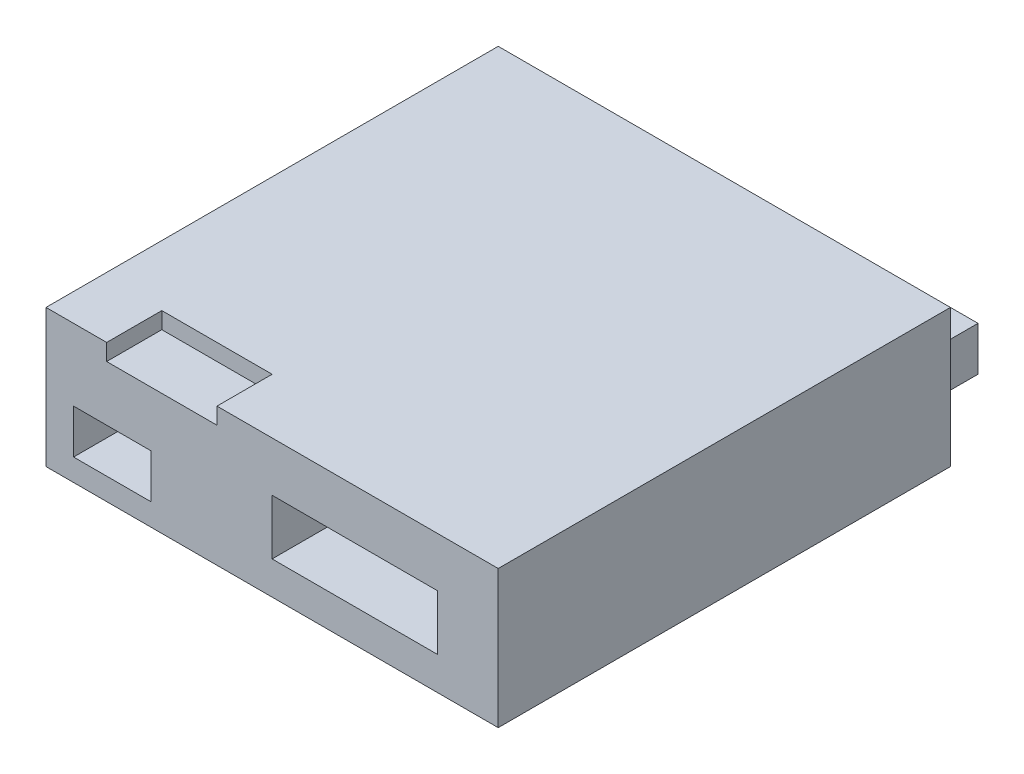
ISO-10303-21;
HEADER;
FILE_DESCRIPTION(('STEP AP214'),'2;1');
FILE_NAME('part.step','',(''),(''),'','','');
FILE_SCHEMA(('AUTOMOTIVE_DESIGN { 1 0 10303 214 1 1 1 1 }'));
ENDSEC;
DATA;
#1=APPLICATION_CONTEXT('core data for automotive mechanical design processes');
#2=APPLICATION_PROTOCOL_DEFINITION('international standard','automotive_design',2000,#1);
#3=PRODUCT_CONTEXT('',#1,'mechanical');
#4=PRODUCT('Part','Part','',(#3));
#5=PRODUCT_RELATED_PRODUCT_CATEGORY('part','',(#4));
#6=PRODUCT_DEFINITION_FORMATION('','',#4);
#7=PRODUCT_DEFINITION_CONTEXT('part definition',#1,'design');
#8=PRODUCT_DEFINITION('design','',#6,#7);
#9=PRODUCT_DEFINITION_SHAPE('','',#8);
#10=(LENGTH_UNIT() NAMED_UNIT(*) SI_UNIT(.MILLI.,.METRE.));
#11=(NAMED_UNIT(*) PLANE_ANGLE_UNIT() SI_UNIT($,.RADIAN.));
#12=(NAMED_UNIT(*) SI_UNIT($,.STERADIAN.) SOLID_ANGLE_UNIT());
#13=UNCERTAINTY_MEASURE_WITH_UNIT(LENGTH_MEASURE(1.E-05),#10,'distance_accuracy_value','');
#14=(GEOMETRIC_REPRESENTATION_CONTEXT(3) GLOBAL_UNCERTAINTY_ASSIGNED_CONTEXT((#13)) GLOBAL_UNIT_ASSIGNED_CONTEXT((#10,
#11,#12)) REPRESENTATION_CONTEXT('',''));
#15=CARTESIAN_POINT('',(0.,0.,0.));
#16=DIRECTION('',(0.,0.,1.));
#17=DIRECTION('',(1.,0.,0.));
#18=AXIS2_PLACEMENT_3D('',#15,#16,#17);
#19=CARTESIAN_POINT('',(0.,12.5,-41.));
#20=DIRECTION('',(0.,0.,1.));
#21=DIRECTION('',(1.,0.,0.));
#22=AXIS2_PLACEMENT_3D('',#19,#20,#21);
#23=PLANE('',#22);
#24=DIRECTION('',(-1.,0.,0.));
#25=VECTOR('',#24,1.);
#26=CARTESIAN_POINT('',(0.,0.,-41.));
#27=LINE('',#26,#25);
#28=CARTESIAN_POINT('',(41.,0.,-41.));
#29=VERTEX_POINT('',#28);
#30=CARTESIAN_POINT('',(0.,0.,-41.));
#31=VERTEX_POINT('',#30);
#32=EDGE_CURVE('E293',#29,#31,#27,.T.);
#33=ORIENTED_EDGE('',*,*,#32,.T.);
#34=DIRECTION('',(0.,-1.,0.));
#35=VECTOR('',#34,1.);
#36=CARTESIAN_POINT('',(0.,12.5,-41.));
#37=LINE('',#36,#35);
#38=CARTESIAN_POINT('',(0.,12.5,-41.));
#39=VERTEX_POINT('',#38);
#40=EDGE_CURVE('E301',#39,#31,#37,.T.);
#41=ORIENTED_EDGE('',*,*,#40,.F.);
#42=DIRECTION('',(-1.,0.,0.));
#43=VECTOR('',#42,1.);
#44=CARTESIAN_POINT('',(0.,12.5,-41.));
#45=LINE('',#44,#43);
#46=CARTESIAN_POINT('',(41.,12.5,-41.));
#47=VERTEX_POINT('',#46);
#48=EDGE_CURVE('E299',#47,#39,#45,.T.);
#49=ORIENTED_EDGE('',*,*,#48,.F.);
#50=DIRECTION('',(0.,-1.,0.));
#51=VECTOR('',#50,1.);
#52=CARTESIAN_POINT('',(41.,12.5,-41.));
#53=LINE('',#52,#51);
#54=EDGE_CURVE('E311',#47,#29,#53,.T.);
#55=ORIENTED_EDGE('',*,*,#54,.T.);
#56=EDGE_LOOP('',(#33,#41,#49,#55));
#57=FACE_BOUND('',#56,.T.);
#58=DIRECTION('',(0.,1.,0.));
#59=VECTOR('',#58,1.);
#60=CARTESIAN_POINT('',(27.5,7.5,-41.));
#61=LINE('',#60,#59);
#62=CARTESIAN_POINT('',(27.5,3.5,-41.));
#63=VERTEX_POINT('',#62);
#64=CARTESIAN_POINT('',(27.5,7.5,-41.));
#65=VERTEX_POINT('',#64);
#66=EDGE_CURVE('E190',#63,#65,#61,.T.);
#67=ORIENTED_EDGE('',*,*,#66,.F.);
#68=DIRECTION('',(-1.,0.,0.));
#69=VECTOR('',#68,1.);
#70=CARTESIAN_POINT('',(27.5,3.5,-41.));
#71=LINE('',#70,#69);
#72=CARTESIAN_POINT('',(38.5,3.5,-41.));
#73=VERTEX_POINT('',#72);
#74=EDGE_CURVE('E187',#73,#63,#71,.T.);
#75=ORIENTED_EDGE('',*,*,#74,.F.);
#76=DIRECTION('',(0.,-1.,0.));
#77=VECTOR('',#76,1.);
#78=CARTESIAN_POINT('',(38.5,7.5,-41.));
#79=LINE('',#78,#77);
#80=CARTESIAN_POINT('',(38.5,7.5,-41.));
#81=VERTEX_POINT('',#80);
#82=EDGE_CURVE('E53',#81,#73,#79,.T.);
#83=ORIENTED_EDGE('',*,*,#82,.F.);
#84=DIRECTION('',(1.,0.,0.));
#85=VECTOR('',#84,1.);
#86=CARTESIAN_POINT('',(27.5,7.5,-41.));
#87=LINE('',#86,#85);
#88=EDGE_CURVE('E48',#65,#81,#87,.T.);
#89=ORIENTED_EDGE('',*,*,#88,.F.);
#90=EDGE_LOOP('',(#67,#75,#83,#89));
#91=FACE_BOUND('',#90,.T.);
#92=ADVANCED_FACE('F33',(#57,#91),#23,.F.);
#93=CARTESIAN_POINT('',(0.,12.5,0.));
#94=DIRECTION('',(1.,0.,0.));
#95=DIRECTION('',(0.,0.,-1.));
#96=AXIS2_PLACEMENT_3D('',#93,#94,#95);
#97=PLANE('',#96);
#98=DIRECTION('',(0.,0.,1.));
#99=VECTOR('',#98,1.);
#100=CARTESIAN_POINT('',(0.,0.,0.));
#101=LINE('',#100,#99);
#102=CARTESIAN_POINT('',(0.,0.,0.));
#103=VERTEX_POINT('',#102);
#104=EDGE_CURVE('E282',#31,#103,#101,.T.);
#105=ORIENTED_EDGE('',*,*,#104,.T.);
#106=DIRECTION('',(0.,-1.,0.));
#107=VECTOR('',#106,1.);
#108=CARTESIAN_POINT('',(0.,12.5,0.));
#109=LINE('',#108,#107);
#110=CARTESIAN_POINT('',(0.,12.5,0.));
#111=VERTEX_POINT('',#110);
#112=EDGE_CURVE('E11',#111,#103,#109,.T.);
#113=ORIENTED_EDGE('',*,*,#112,.F.);
#114=DIRECTION('',(0.,0.,1.));
#115=VECTOR('',#114,1.);
#116=CARTESIAN_POINT('',(0.,12.5,0.));
#117=LINE('',#116,#115);
#118=EDGE_CURVE('E289',#39,#111,#117,.T.);
#119=ORIENTED_EDGE('',*,*,#118,.F.);
#120=ORIENTED_EDGE('',*,*,#40,.T.);
#121=EDGE_LOOP('',(#105,#113,#119,#120));
#122=FACE_BOUND('',#121,.T.);
#123=ADVANCED_FACE('F35',(#122),#97,.F.);
#124=CARTESIAN_POINT('',(0.,12.5,0.));
#125=DIRECTION('',(0.,0.,-1.));
#126=DIRECTION('',(-1.,0.,0.));
#127=AXIS2_PLACEMENT_3D('',#124,#125,#126);
#128=PLANE('',#127);
#129=DIRECTION('',(1.,0.,0.));
#130=VECTOR('',#129,1.);
#131=CARTESIAN_POINT('',(20.5,3.,0.));
#132=LINE('',#131,#130);
#133=CARTESIAN_POINT('',(20.5,3.,0.));
#134=VERTEX_POINT('',#133);
#135=CARTESIAN_POINT('',(35.5,3.,0.));
#136=VERTEX_POINT('',#135);
#137=EDGE_CURVE('E193',#134,#136,#132,.T.);
#138=ORIENTED_EDGE('',*,*,#137,.F.);
#139=DIRECTION('',(0.,-1.,0.));
#140=VECTOR('',#139,1.);
#141=CARTESIAN_POINT('',(20.5,8.,0.));
#142=LINE('',#141,#140);
#143=CARTESIAN_POINT('',(20.5,8.,0.));
#144=VERTEX_POINT('',#143);
#145=EDGE_CURVE('E191',#144,#134,#142,.T.);
#146=ORIENTED_EDGE('',*,*,#145,.F.);
#147=DIRECTION('',(-1.,0.,0.));
#148=VECTOR('',#147,1.);
#149=CARTESIAN_POINT('',(20.5,8.,0.));
#150=LINE('',#149,#148);
#151=CARTESIAN_POINT('',(35.5,8.,0.));
#152=VERTEX_POINT('',#151);
#153=EDGE_CURVE('E203',#152,#144,#150,.T.);
#154=ORIENTED_EDGE('',*,*,#153,.F.);
#155=DIRECTION('',(0.,1.,0.));
#156=VECTOR('',#155,1.);
#157=CARTESIAN_POINT('',(35.5,8.,0.));
#158=LINE('',#157,#156);
#159=EDGE_CURVE('E215',#136,#152,#158,.T.);
#160=ORIENTED_EDGE('',*,*,#159,.F.);
#161=EDGE_LOOP('',(#138,#146,#154,#160));
#162=FACE_BOUND('',#161,.T.);
#163=DIRECTION('',(1.,0.,0.));
#164=VECTOR('',#163,1.);
#165=CARTESIAN_POINT('',(2.5,2.,0.));
#166=LINE('',#165,#164);
#167=CARTESIAN_POINT('',(2.5,2.,0.));
#168=VERTEX_POINT('',#167);
#169=CARTESIAN_POINT('',(9.5,2.,0.));
#170=VERTEX_POINT('',#169);
#171=EDGE_CURVE('E244',#168,#170,#166,.T.);
#172=ORIENTED_EDGE('',*,*,#171,.F.);
#173=DIRECTION('',(0.,-1.,0.));
#174=VECTOR('',#173,1.);
#175=CARTESIAN_POINT('',(2.5,6.,0.));
#176=LINE('',#175,#174);
#177=CARTESIAN_POINT('',(2.5,6.,0.));
#178=VERTEX_POINT('',#177);
#179=EDGE_CURVE('E222',#178,#168,#176,.T.);
#180=ORIENTED_EDGE('',*,*,#179,.F.);
#181=DIRECTION('',(-1.,0.,0.));
#182=VECTOR('',#181,1.);
#183=CARTESIAN_POINT('',(2.5,6.,0.));
#184=LINE('',#183,#182);
#185=CARTESIAN_POINT('',(9.5,6.,0.));
#186=VERTEX_POINT('',#185);
#187=EDGE_CURVE('E233',#186,#178,#184,.T.);
#188=ORIENTED_EDGE('',*,*,#187,.F.);
#189=DIRECTION('',(0.,1.,0.));
#190=VECTOR('',#189,1.);
#191=CARTESIAN_POINT('',(9.5,6.,0.));
#192=LINE('',#191,#190);
#193=EDGE_CURVE('E247',#170,#186,#192,.T.);
#194=ORIENTED_EDGE('',*,*,#193,.F.);
#195=EDGE_LOOP('',(#172,#180,#188,#194));
#196=FACE_BOUND('',#195,.T.);
#197=DIRECTION('',(1.,0.,0.));
#198=VECTOR('',#197,1.);
#199=CARTESIAN_POINT('',(5.5,11.,0.));
#200=LINE('',#199,#198);
#201=CARTESIAN_POINT('',(5.5,11.,0.));
#202=VERTEX_POINT('',#201);
#203=CARTESIAN_POINT('',(15.5,11.,0.));
#204=VERTEX_POINT('',#203);
#205=EDGE_CURVE('E276',#202,#204,#200,.T.);
#206=ORIENTED_EDGE('',*,*,#205,.F.);
#207=DIRECTION('',(0.,-1.,0.));
#208=VECTOR('',#207,1.);
#209=CARTESIAN_POINT('',(5.5,12.5,0.));
#210=LINE('',#209,#208);
#211=CARTESIAN_POINT('',(5.5,12.5,0.));
#212=VERTEX_POINT('',#211);
#213=EDGE_CURVE('E254',#212,#202,#210,.T.);
#214=ORIENTED_EDGE('',*,*,#213,.F.);
#215=DIRECTION('',(1.,0.,0.));
#216=VECTOR('',#215,1.);
#217=CARTESIAN_POINT('',(0.,12.5,0.));
#218=LINE('',#217,#216);
#219=EDGE_CURVE('E294',#111,#212,#218,.T.);
#220=ORIENTED_EDGE('',*,*,#219,.F.);
#221=ORIENTED_EDGE('',*,*,#112,.T.);
#222=DIRECTION('',(1.,0.,0.));
#223=VECTOR('',#222,1.);
#224=CARTESIAN_POINT('',(0.,0.,0.));
#225=LINE('',#224,#223);
#226=CARTESIAN_POINT('',(41.,0.,0.));
#227=VERTEX_POINT('',#226);
#228=EDGE_CURVE('E304',#103,#227,#225,.T.);
#229=ORIENTED_EDGE('',*,*,#228,.T.);
#230=DIRECTION('',(0.,-1.,0.));
#231=VECTOR('',#230,1.);
#232=CARTESIAN_POINT('',(41.,12.5,0.));
#233=LINE('',#232,#231);
#234=CARTESIAN_POINT('',(41.,12.5,0.));
#235=VERTEX_POINT('',#234);
#236=EDGE_CURVE('E41',#235,#227,#233,.T.);
#237=ORIENTED_EDGE('',*,*,#236,.F.);
#238=CARTESIAN_POINT('',(15.5,12.5,0.));
#239=VERTEX_POINT('',#238);
#240=EDGE_CURVE('E292',#239,#235,#218,.T.);
#241=ORIENTED_EDGE('',*,*,#240,.F.);
#242=DIRECTION('',(0.,1.,0.));
#243=VECTOR('',#242,1.);
#244=CARTESIAN_POINT('',(15.5,12.5,0.));
#245=LINE('',#244,#243);
#246=EDGE_CURVE('E265',#204,#239,#245,.T.);
#247=ORIENTED_EDGE('',*,*,#246,.F.);
#248=EDGE_LOOP('',(#206,#214,#220,#221,#229,#237,#241,#247));
#249=FACE_BOUND('',#248,.T.);
#250=ADVANCED_FACE('F339',(#162,#196,#249),#128,.F.);
#251=CARTESIAN_POINT('',(41.,12.5,0.));
#252=DIRECTION('',(-1.,0.,0.));
#253=DIRECTION('',(0.,0.,1.));
#254=AXIS2_PLACEMENT_3D('',#251,#252,#253);
#255=PLANE('',#254);
#256=DIRECTION('',(0.,0.,-1.));
#257=VECTOR('',#256,1.);
#258=CARTESIAN_POINT('',(41.,0.,0.));
#259=LINE('',#258,#257);
#260=EDGE_CURVE('E306',#227,#29,#259,.T.);
#261=ORIENTED_EDGE('',*,*,#260,.T.);
#262=ORIENTED_EDGE('',*,*,#54,.F.);
#263=DIRECTION('',(0.,0.,-1.));
#264=VECTOR('',#263,1.);
#265=CARTESIAN_POINT('',(41.,12.5,0.));
#266=LINE('',#265,#264);
#267=EDGE_CURVE('E297',#235,#47,#266,.T.);
#268=ORIENTED_EDGE('',*,*,#267,.F.);
#269=ORIENTED_EDGE('',*,*,#236,.T.);
#270=EDGE_LOOP('',(#261,#262,#268,#269));
#271=FACE_BOUND('',#270,.T.);
#272=ADVANCED_FACE('F318',(#271),#255,.F.);
#273=CARTESIAN_POINT('',(0.,12.5,0.));
#274=DIRECTION('',(0.,-1.,0.));
#275=DIRECTION('',(0.,0.,-1.));
#276=AXIS2_PLACEMENT_3D('',#273,#274,#275);
#277=PLANE('',#276);
#278=ORIENTED_EDGE('',*,*,#219,.T.);
#279=DIRECTION('',(0.,0.,1.));
#280=VECTOR('',#279,1.);
#281=CARTESIAN_POINT('',(5.5,12.5,-5.));
#282=LINE('',#281,#280);
#283=CARTESIAN_POINT('',(5.5,12.5,-5.));
#284=VERTEX_POINT('',#283);
#285=EDGE_CURVE('E280',#284,#212,#282,.T.);
#286=ORIENTED_EDGE('',*,*,#285,.F.);
#287=DIRECTION('',(-1.,0.,0.));
#288=VECTOR('',#287,1.);
#289=CARTESIAN_POINT('',(5.5,12.5,-5.));
#290=LINE('',#289,#288);
#291=CARTESIAN_POINT('',(15.5,12.5,-5.));
#292=VERTEX_POINT('',#291);
#293=EDGE_CURVE('E270',#292,#284,#290,.T.);
#294=ORIENTED_EDGE('',*,*,#293,.F.);
#295=DIRECTION('',(0.,0.,1.));
#296=VECTOR('',#295,1.);
#297=CARTESIAN_POINT('',(15.5,12.5,-5.));
#298=LINE('',#297,#296);
#299=EDGE_CURVE('E283',#292,#239,#298,.T.);
#300=ORIENTED_EDGE('',*,*,#299,.T.);
#301=ORIENTED_EDGE('',*,*,#240,.T.);
#302=ORIENTED_EDGE('',*,*,#267,.T.);
#303=ORIENTED_EDGE('',*,*,#48,.T.);
#304=ORIENTED_EDGE('',*,*,#118,.T.);
#305=EDGE_LOOP('',(#278,#286,#294,#300,#301,#302,#303,#304));
#306=FACE_BOUND('',#305,.T.);
#307=ADVANCED_FACE('F333',(#306),#277,.F.);
#308=CARTESIAN_POINT('',(0.,0.,0.));
#309=DIRECTION('',(0.,-1.,0.));
#310=DIRECTION('',(0.,0.,-1.));
#311=AXIS2_PLACEMENT_3D('',#308,#309,#310);
#312=PLANE('',#311);
#313=ORIENTED_EDGE('',*,*,#104,.F.);
#314=ORIENTED_EDGE('',*,*,#32,.F.);
#315=ORIENTED_EDGE('',*,*,#260,.F.);
#316=ORIENTED_EDGE('',*,*,#228,.F.);
#317=EDGE_LOOP('',(#313,#314,#315,#316));
#318=FACE_BOUND('',#317,.T.);
#319=ADVANCED_FACE('F325',(#318),#312,.T.);
#320=CARTESIAN_POINT('',(5.5,12.5,-5.));
#321=DIRECTION('',(-1.,0.,0.));
#322=DIRECTION('',(0.,-1.,0.));
#323=AXIS2_PLACEMENT_3D('',#320,#321,#322);
#324=PLANE('',#323);
#325=ORIENTED_EDGE('',*,*,#213,.T.);
#326=DIRECTION('',(0.,0.,1.));
#327=VECTOR('',#326,1.);
#328=CARTESIAN_POINT('',(5.5,11.,-5.));
#329=LINE('',#328,#327);
#330=CARTESIAN_POINT('',(5.5,11.,-5.));
#331=VERTEX_POINT('',#330);
#332=EDGE_CURVE('E273',#331,#202,#329,.T.);
#333=ORIENTED_EDGE('',*,*,#332,.F.);
#334=DIRECTION('',(0.,-1.,0.));
#335=VECTOR('',#334,1.);
#336=CARTESIAN_POINT('',(5.5,12.5,-5.));
#337=LINE('',#336,#335);
#338=EDGE_CURVE('E261',#284,#331,#337,.T.);
#339=ORIENTED_EDGE('',*,*,#338,.F.);
#340=ORIENTED_EDGE('',*,*,#285,.T.);
#341=EDGE_LOOP('',(#325,#333,#339,#340));
#342=FACE_BOUND('',#341,.T.);
#343=ADVANCED_FACE('F348',(#342),#324,.F.);
#344=CARTESIAN_POINT('',(15.5,12.5,-5.));
#345=DIRECTION('',(1.,0.,0.));
#346=DIRECTION('',(0.,0.,-1.));
#347=AXIS2_PLACEMENT_3D('',#344,#345,#346);
#348=PLANE('',#347);
#349=ORIENTED_EDGE('',*,*,#246,.T.);
#350=ORIENTED_EDGE('',*,*,#299,.F.);
#351=DIRECTION('',(0.,1.,0.));
#352=VECTOR('',#351,1.);
#353=CARTESIAN_POINT('',(15.5,12.5,-5.));
#354=LINE('',#353,#352);
#355=CARTESIAN_POINT('',(15.5,11.,-5.));
#356=VERTEX_POINT('',#355);
#357=EDGE_CURVE('E268',#356,#292,#354,.T.);
#358=ORIENTED_EDGE('',*,*,#357,.F.);
#359=DIRECTION('',(0.,0.,1.));
#360=VECTOR('',#359,1.);
#361=CARTESIAN_POINT('',(15.5,11.,-5.));
#362=LINE('',#361,#360);
#363=EDGE_CURVE('E286',#356,#204,#362,.T.);
#364=ORIENTED_EDGE('',*,*,#363,.T.);
#365=EDGE_LOOP('',(#349,#350,#358,#364));
#366=FACE_BOUND('',#365,.T.);
#367=ADVANCED_FACE('F342',(#366),#348,.F.);
#368=CARTESIAN_POINT('',(5.5,11.,-5.));
#369=DIRECTION('',(0.,-1.,0.));
#370=DIRECTION('',(0.,0.,-1.));
#371=AXIS2_PLACEMENT_3D('',#368,#369,#370);
#372=PLANE('',#371);
#373=ORIENTED_EDGE('',*,*,#205,.T.);
#374=ORIENTED_EDGE('',*,*,#363,.F.);
#375=DIRECTION('',(1.,0.,0.));
#376=VECTOR('',#375,1.);
#377=CARTESIAN_POINT('',(5.5,11.,-5.));
#378=LINE('',#377,#376);
#379=EDGE_CURVE('E264',#331,#356,#378,.T.);
#380=ORIENTED_EDGE('',*,*,#379,.F.);
#381=ORIENTED_EDGE('',*,*,#332,.T.);
#382=EDGE_LOOP('',(#373,#374,#380,#381));
#383=FACE_BOUND('',#382,.T.);
#384=ADVANCED_FACE('F346',(#383),#372,.F.);
#385=CARTESIAN_POINT('',(0.,0.,-5.));
#386=DIRECTION('',(0.,0.,1.));
#387=DIRECTION('',(1.,0.,0.));
#388=AXIS2_PLACEMENT_3D('',#385,#386,#387);
#389=PLANE('',#388);
#390=ORIENTED_EDGE('',*,*,#338,.T.);
#391=ORIENTED_EDGE('',*,*,#379,.T.);
#392=ORIENTED_EDGE('',*,*,#357,.T.);
#393=ORIENTED_EDGE('',*,*,#293,.T.);
#394=EDGE_LOOP('',(#390,#391,#392,#393));
#395=FACE_BOUND('',#394,.T.);
#396=ADVANCED_FACE('F350',(#395),#389,.T.);
#397=CARTESIAN_POINT('',(2.5,6.,-5.));
#398=DIRECTION('',(-1.,0.,0.));
#399=DIRECTION('',(0.,-1.,0.));
#400=AXIS2_PLACEMENT_3D('',#397,#398,#399);
#401=PLANE('',#400);
#402=ORIENTED_EDGE('',*,*,#179,.T.);
#403=DIRECTION('',(0.,0.,1.));
#404=VECTOR('',#403,1.);
#405=CARTESIAN_POINT('',(2.5,2.,-5.));
#406=LINE('',#405,#404);
#407=CARTESIAN_POINT('',(2.5,2.,-5.));
#408=VERTEX_POINT('',#407);
#409=EDGE_CURVE('E242',#408,#168,#406,.T.);
#410=ORIENTED_EDGE('',*,*,#409,.F.);
#411=DIRECTION('',(0.,-1.,0.));
#412=VECTOR('',#411,1.);
#413=CARTESIAN_POINT('',(2.5,6.,-5.));
#414=LINE('',#413,#412);
#415=CARTESIAN_POINT('',(2.5,6.,-5.));
#416=VERTEX_POINT('',#415);
#417=EDGE_CURVE('E229',#416,#408,#414,.T.);
#418=ORIENTED_EDGE('',*,*,#417,.F.);
#419=DIRECTION('',(0.,0.,1.));
#420=VECTOR('',#419,1.);
#421=CARTESIAN_POINT('',(2.5,6.,-5.));
#422=LINE('',#421,#420);
#423=EDGE_CURVE('E252',#416,#178,#422,.T.);
#424=ORIENTED_EDGE('',*,*,#423,.T.);
#425=EDGE_LOOP('',(#402,#410,#418,#424));
#426=FACE_BOUND('',#425,.T.);
#427=ADVANCED_FACE('F352',(#426),#401,.F.);
#428=CARTESIAN_POINT('',(2.5,6.,-5.));
#429=DIRECTION('',(0.,1.,0.));
#430=DIRECTION('',(0.,0.,1.));
#431=AXIS2_PLACEMENT_3D('',#428,#429,#430);
#432=PLANE('',#431);
#433=ORIENTED_EDGE('',*,*,#187,.T.);
#434=ORIENTED_EDGE('',*,*,#423,.F.);
#435=DIRECTION('',(-1.,0.,0.));
#436=VECTOR('',#435,1.);
#437=CARTESIAN_POINT('',(2.5,6.,-5.));
#438=LINE('',#437,#436);
#439=CARTESIAN_POINT('',(9.5,6.,-5.));
#440=VERTEX_POINT('',#439);
#441=EDGE_CURVE('E239',#440,#416,#438,.T.);
#442=ORIENTED_EDGE('',*,*,#441,.F.);
#443=DIRECTION('',(0.,0.,1.));
#444=VECTOR('',#443,1.);
#445=CARTESIAN_POINT('',(9.5,6.,-5.));
#446=LINE('',#445,#444);
#447=EDGE_CURVE('E255',#440,#186,#446,.T.);
#448=ORIENTED_EDGE('',*,*,#447,.T.);
#449=EDGE_LOOP('',(#433,#434,#442,#448));
#450=FACE_BOUND('',#449,.T.);
#451=ADVANCED_FACE('F358',(#450),#432,.F.);
#452=CARTESIAN_POINT('',(9.5,6.,-5.));
#453=DIRECTION('',(1.,0.,0.));
#454=DIRECTION('',(0.,0.,-1.));
#455=AXIS2_PLACEMENT_3D('',#452,#453,#454);
#456=PLANE('',#455);
#457=ORIENTED_EDGE('',*,*,#193,.T.);
#458=ORIENTED_EDGE('',*,*,#447,.F.);
#459=DIRECTION('',(0.,1.,0.));
#460=VECTOR('',#459,1.);
#461=CARTESIAN_POINT('',(9.5,6.,-5.));
#462=LINE('',#461,#460);
#463=CARTESIAN_POINT('',(9.5,2.,-5.));
#464=VERTEX_POINT('',#463);
#465=EDGE_CURVE('E236',#464,#440,#462,.T.);
#466=ORIENTED_EDGE('',*,*,#465,.F.);
#467=DIRECTION('',(0.,0.,1.));
#468=VECTOR('',#467,1.);
#469=CARTESIAN_POINT('',(9.5,2.,-5.));
#470=LINE('',#469,#468);
#471=EDGE_CURVE('E257',#464,#170,#470,.T.);
#472=ORIENTED_EDGE('',*,*,#471,.T.);
#473=EDGE_LOOP('',(#457,#458,#466,#472));
#474=FACE_BOUND('',#473,.T.);
#475=ADVANCED_FACE('F392',(#474),#456,.F.);
#476=CARTESIAN_POINT('',(2.5,2.,-5.));
#477=DIRECTION('',(0.,-1.,0.));
#478=DIRECTION('',(0.,0.,-1.));
#479=AXIS2_PLACEMENT_3D('',#476,#477,#478);
#480=PLANE('',#479);
#481=ORIENTED_EDGE('',*,*,#171,.T.);
#482=ORIENTED_EDGE('',*,*,#471,.F.);
#483=DIRECTION('',(1.,0.,0.));
#484=VECTOR('',#483,1.);
#485=CARTESIAN_POINT('',(2.5,2.,-5.));
#486=LINE('',#485,#484);
#487=EDGE_CURVE('E232',#408,#464,#486,.T.);
#488=ORIENTED_EDGE('',*,*,#487,.F.);
#489=ORIENTED_EDGE('',*,*,#409,.T.);
#490=EDGE_LOOP('',(#481,#482,#488,#489));
#491=FACE_BOUND('',#490,.T.);
#492=ADVANCED_FACE('F385',(#491),#480,.F.);
#493=CARTESIAN_POINT('',(0.,0.,-5.));
#494=DIRECTION('',(0.,0.,1.));
#495=DIRECTION('',(1.,0.,0.));
#496=AXIS2_PLACEMENT_3D('',#493,#494,#495);
#497=PLANE('',#496);
#498=ORIENTED_EDGE('',*,*,#417,.T.);
#499=ORIENTED_EDGE('',*,*,#487,.T.);
#500=ORIENTED_EDGE('',*,*,#465,.T.);
#501=ORIENTED_EDGE('',*,*,#441,.T.);
#502=EDGE_LOOP('',(#498,#499,#500,#501));
#503=FACE_BOUND('',#502,.T.);
#504=ADVANCED_FACE('F394',(#503),#497,.T.);
#505=CARTESIAN_POINT('',(20.5,8.,-5.));
#506=DIRECTION('',(-1.,0.,0.));
#507=DIRECTION('',(0.,0.,1.));
#508=AXIS2_PLACEMENT_3D('',#505,#506,#507);
#509=PLANE('',#508);
#510=ORIENTED_EDGE('',*,*,#145,.T.);
#511=DIRECTION('',(0.,0.,1.));
#512=VECTOR('',#511,1.);
#513=CARTESIAN_POINT('',(20.5,3.,-5.));
#514=LINE('',#513,#512);
#515=CARTESIAN_POINT('',(20.5,3.,-5.));
#516=VERTEX_POINT('',#515);
#517=EDGE_CURVE('E211',#516,#134,#514,.T.);
#518=ORIENTED_EDGE('',*,*,#517,.F.);
#519=DIRECTION('',(0.,-1.,0.));
#520=VECTOR('',#519,1.);
#521=CARTESIAN_POINT('',(20.5,8.,-5.));
#522=LINE('',#521,#520);
#523=CARTESIAN_POINT('',(20.5,8.,-5.));
#524=VERTEX_POINT('',#523);
#525=EDGE_CURVE('E199',#524,#516,#522,.T.);
#526=ORIENTED_EDGE('',*,*,#525,.F.);
#527=DIRECTION('',(0.,0.,1.));
#528=VECTOR('',#527,1.);
#529=CARTESIAN_POINT('',(20.5,8.,-5.));
#530=LINE('',#529,#528);
#531=EDGE_CURVE('E220',#524,#144,#530,.T.);
#532=ORIENTED_EDGE('',*,*,#531,.T.);
#533=EDGE_LOOP('',(#510,#518,#526,#532));
#534=FACE_BOUND('',#533,.T.);
#535=ADVANCED_FACE('F396',(#534),#509,.F.);
#536=CARTESIAN_POINT('',(20.5,8.,-5.));
#537=DIRECTION('',(0.,1.,0.));
#538=DIRECTION('',(0.,0.,1.));
#539=AXIS2_PLACEMENT_3D('',#536,#537,#538);
#540=PLANE('',#539);
#541=ORIENTED_EDGE('',*,*,#153,.T.);
#542=ORIENTED_EDGE('',*,*,#531,.F.);
#543=DIRECTION('',(-1.,0.,0.));
#544=VECTOR('',#543,1.);
#545=CARTESIAN_POINT('',(20.5,8.,-5.));
#546=LINE('',#545,#544);
#547=CARTESIAN_POINT('',(35.5,8.,-5.));
#548=VERTEX_POINT('',#547);
#549=EDGE_CURVE('E209',#548,#524,#546,.T.);
#550=ORIENTED_EDGE('',*,*,#549,.F.);
#551=DIRECTION('',(0.,0.,1.));
#552=VECTOR('',#551,1.);
#553=CARTESIAN_POINT('',(35.5,8.,-5.));
#554=LINE('',#553,#552);
#555=EDGE_CURVE('E223',#548,#152,#554,.T.);
#556=ORIENTED_EDGE('',*,*,#555,.T.);
#557=EDGE_LOOP('',(#541,#542,#550,#556));
#558=FACE_BOUND('',#557,.T.);
#559=ADVANCED_FACE('F402',(#558),#540,.F.);
#560=CARTESIAN_POINT('',(35.5,8.,-5.));
#561=DIRECTION('',(1.,0.,0.));
#562=DIRECTION('',(0.,0.,-1.));
#563=AXIS2_PLACEMENT_3D('',#560,#561,#562);
#564=PLANE('',#563);
#565=ORIENTED_EDGE('',*,*,#159,.T.);
#566=ORIENTED_EDGE('',*,*,#555,.F.);
#567=DIRECTION('',(0.,1.,0.));
#568=VECTOR('',#567,1.);
#569=CARTESIAN_POINT('',(35.5,8.,-5.));
#570=LINE('',#569,#568);
#571=CARTESIAN_POINT('',(35.5,3.,-5.));
#572=VERTEX_POINT('',#571);
#573=EDGE_CURVE('E206',#572,#548,#570,.T.);
#574=ORIENTED_EDGE('',*,*,#573,.F.);
#575=DIRECTION('',(0.,0.,1.));
#576=VECTOR('',#575,1.);
#577=CARTESIAN_POINT('',(35.5,3.,-5.));
#578=LINE('',#577,#576);
#579=EDGE_CURVE('E225',#572,#136,#578,.T.);
#580=ORIENTED_EDGE('',*,*,#579,.T.);
#581=EDGE_LOOP('',(#565,#566,#574,#580));
#582=FACE_BOUND('',#581,.T.);
#583=ADVANCED_FACE('F444',(#582),#564,.F.);
#584=CARTESIAN_POINT('',(20.5,3.,-5.));
#585=DIRECTION('',(0.,-1.,0.));
#586=DIRECTION('',(0.,0.,-1.));
#587=AXIS2_PLACEMENT_3D('',#584,#585,#586);
#588=PLANE('',#587);
#589=ORIENTED_EDGE('',*,*,#137,.T.);
#590=ORIENTED_EDGE('',*,*,#579,.F.);
#591=DIRECTION('',(1.,0.,0.));
#592=VECTOR('',#591,1.);
#593=CARTESIAN_POINT('',(20.5,3.,-5.));
#594=LINE('',#593,#592);
#595=EDGE_CURVE('E202',#516,#572,#594,.T.);
#596=ORIENTED_EDGE('',*,*,#595,.F.);
#597=ORIENTED_EDGE('',*,*,#517,.T.);
#598=EDGE_LOOP('',(#589,#590,#596,#597));
#599=FACE_BOUND('',#598,.T.);
#600=ADVANCED_FACE('F454',(#599),#588,.F.);
#601=CARTESIAN_POINT('',(0.,0.,-5.));
#602=DIRECTION('',(0.,0.,1.));
#603=DIRECTION('',(1.,0.,0.));
#604=AXIS2_PLACEMENT_3D('',#601,#602,#603);
#605=PLANE('',#604);
#606=ORIENTED_EDGE('',*,*,#525,.T.);
#607=ORIENTED_EDGE('',*,*,#595,.T.);
#608=ORIENTED_EDGE('',*,*,#573,.T.);
#609=ORIENTED_EDGE('',*,*,#549,.T.);
#610=EDGE_LOOP('',(#606,#607,#608,#609));
#611=FACE_BOUND('',#610,.T.);
#612=ADVANCED_FACE('F464',(#611),#605,.T.);
#613=CARTESIAN_POINT('',(27.5,7.5,-46.));
#614=DIRECTION('',(1.,0.,0.));
#615=DIRECTION('',(0.,1.,0.));
#616=AXIS2_PLACEMENT_3D('',#613,#614,#615);
#617=PLANE('',#616);
#618=ORIENTED_EDGE('',*,*,#66,.T.);
#619=DIRECTION('',(0.,0.,1.));
#620=VECTOR('',#619,1.);
#621=CARTESIAN_POINT('',(27.5,7.5,-46.));
#622=LINE('',#621,#620);
#623=CARTESIAN_POINT('',(27.5,7.5,-46.));
#624=VERTEX_POINT('',#623);
#625=EDGE_CURVE('E171',#624,#65,#622,.T.);
#626=ORIENTED_EDGE('',*,*,#625,.F.);
#627=DIRECTION('',(0.,1.,0.));
#628=VECTOR('',#627,1.);
#629=CARTESIAN_POINT('',(27.5,7.5,-46.));
#630=LINE('',#629,#628);
#631=CARTESIAN_POINT('',(27.5,3.5,-46.));
#632=VERTEX_POINT('',#631);
#633=EDGE_CURVE('E178',#632,#624,#630,.T.);
#634=ORIENTED_EDGE('',*,*,#633,.F.);
#635=DIRECTION('',(0.,0.,1.));
#636=VECTOR('',#635,1.);
#637=CARTESIAN_POINT('',(27.5,3.5,-46.));
#638=LINE('',#637,#636);
#639=EDGE_CURVE('E527',#632,#63,#638,.T.);
#640=ORIENTED_EDGE('',*,*,#639,.T.);
#641=EDGE_LOOP('',(#618,#626,#634,#640));
#642=FACE_BOUND('',#641,.T.);
#643=ADVANCED_FACE('F189',(#642),#617,.F.);
#644=CARTESIAN_POINT('',(27.5,7.5,-46.));
#645=DIRECTION('',(0.,-1.,0.));
#646=DIRECTION('',(1.,0.,0.));
#647=AXIS2_PLACEMENT_3D('',#644,#645,#646);
#648=PLANE('',#647);
#649=ORIENTED_EDGE('',*,*,#88,.T.);
#650=DIRECTION('',(0.,0.,1.));
#651=VECTOR('',#650,1.);
#652=CARTESIAN_POINT('',(38.5,7.5,-46.));
#653=LINE('',#652,#651);
#654=CARTESIAN_POINT('',(38.5,7.5,-46.));
#655=VERTEX_POINT('',#654);
#656=EDGE_CURVE('E174',#655,#81,#653,.T.);
#657=ORIENTED_EDGE('',*,*,#656,.F.);
#658=DIRECTION('',(1.,0.,0.));
#659=VECTOR('',#658,1.);
#660=CARTESIAN_POINT('',(27.5,7.5,-46.));
#661=LINE('',#660,#659);
#662=EDGE_CURVE('E167',#624,#655,#661,.T.);
#663=ORIENTED_EDGE('',*,*,#662,.F.);
#664=ORIENTED_EDGE('',*,*,#625,.T.);
#665=EDGE_LOOP('',(#649,#657,#663,#664));
#666=FACE_BOUND('',#665,.T.);
#667=ADVANCED_FACE('F169',(#666),#648,.F.);
#668=CARTESIAN_POINT('',(38.5,7.5,-46.));
#669=DIRECTION('',(-1.,0.,0.));
#670=DIRECTION('',(0.,0.,1.));
#671=AXIS2_PLACEMENT_3D('',#668,#669,#670);
#672=PLANE('',#671);
#673=ORIENTED_EDGE('',*,*,#82,.T.);
#674=DIRECTION('',(0.,0.,1.));
#675=VECTOR('',#674,1.);
#676=CARTESIAN_POINT('',(38.5,3.5,-46.));
#677=LINE('',#676,#675);
#678=CARTESIAN_POINT('',(38.5,3.5,-46.));
#679=VERTEX_POINT('',#678);
#680=EDGE_CURVE('E195',#679,#73,#677,.T.);
#681=ORIENTED_EDGE('',*,*,#680,.F.);
#682=DIRECTION('',(0.,-1.,0.));
#683=VECTOR('',#682,1.);
#684=CARTESIAN_POINT('',(38.5,7.5,-46.));
#685=LINE('',#684,#683);
#686=EDGE_CURVE('E177',#655,#679,#685,.T.);
#687=ORIENTED_EDGE('',*,*,#686,.F.);
#688=ORIENTED_EDGE('',*,*,#656,.T.);
#689=EDGE_LOOP('',(#673,#681,#687,#688));
#690=FACE_BOUND('',#689,.T.);
#691=ADVANCED_FACE('F494',(#690),#672,.F.);
#692=CARTESIAN_POINT('',(27.5,3.5,-46.));
#693=DIRECTION('',(0.,1.,0.));
#694=DIRECTION('',(-1.,0.,0.));
#695=AXIS2_PLACEMENT_3D('',#692,#693,#694);
#696=PLANE('',#695);
#697=ORIENTED_EDGE('',*,*,#74,.T.);
#698=ORIENTED_EDGE('',*,*,#639,.F.);
#699=DIRECTION('',(-1.,0.,0.));
#700=VECTOR('',#699,1.);
#701=CARTESIAN_POINT('',(27.5,3.5,-46.));
#702=LINE('',#701,#700);
#703=EDGE_CURVE('E183',#679,#632,#702,.T.);
#704=ORIENTED_EDGE('',*,*,#703,.F.);
#705=ORIENTED_EDGE('',*,*,#680,.T.);
#706=EDGE_LOOP('',(#697,#698,#704,#705));
#707=FACE_BOUND('',#706,.T.);
#708=ADVANCED_FACE('F503',(#707),#696,.F.);
#709=CARTESIAN_POINT('',(0.,0.,-46.));
#710=DIRECTION('',(0.,0.,1.));
#711=DIRECTION('',(1.,0.,0.));
#712=AXIS2_PLACEMENT_3D('',#709,#710,#711);
#713=PLANE('',#712);
#714=ORIENTED_EDGE('',*,*,#633,.T.);
#715=ORIENTED_EDGE('',*,*,#662,.T.);
#716=ORIENTED_EDGE('',*,*,#686,.T.);
#717=ORIENTED_EDGE('',*,*,#703,.T.);
#718=EDGE_LOOP('',(#714,#715,#716,#717));
#719=FACE_BOUND('',#718,.T.);
#720=ADVANCED_FACE('F181',(#719),#713,.F.);
#721=CLOSED_SHELL('',(#92,#123,#250,#272,#307,#319,#343,#367,#384,#396,#427,#451,#475,#492,#504,
#535,#559,#583,#600,#612,#643,#667,#691,#708,#720));
#722=MANIFOLD_SOLID_BREP('B2',#721);
#723=ADVANCED_BREP_SHAPE_REPRESENTATION('',(#18,#722),#14);
#724=SHAPE_DEFINITION_REPRESENTATION(#9,#723);
ENDSEC;
END-ISO-10303-21;
